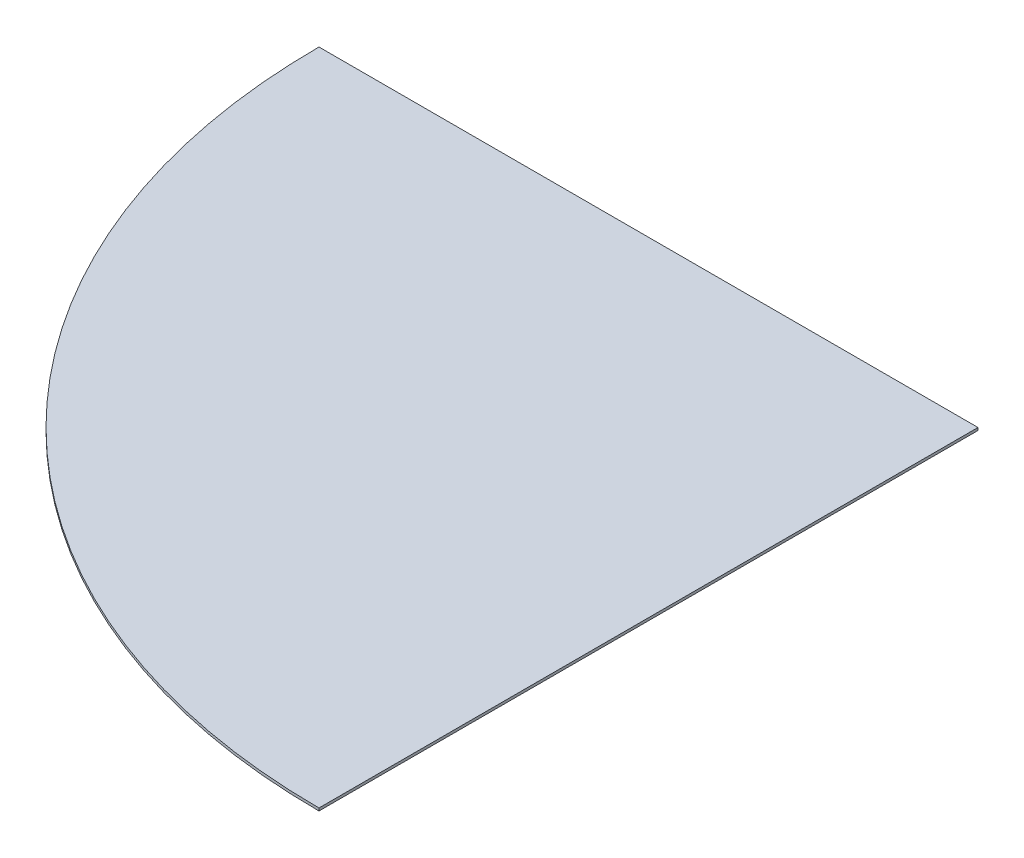
ISO-10303-21;
HEADER;
FILE_DESCRIPTION(('STEP AP214'),'2;1');
FILE_NAME('part.step','',(''),(''),'','','');
FILE_SCHEMA(('AUTOMOTIVE_DESIGN { 1 0 10303 214 1 1 1 1 }'));
ENDSEC;
DATA;
#1=APPLICATION_CONTEXT('core data for automotive mechanical design processes');
#2=APPLICATION_PROTOCOL_DEFINITION('international standard','automotive_design',2000,#1);
#3=PRODUCT_CONTEXT('',#1,'mechanical');
#4=PRODUCT('Part','Part','',(#3));
#5=PRODUCT_RELATED_PRODUCT_CATEGORY('part','',(#4));
#6=PRODUCT_DEFINITION_FORMATION('','',#4);
#7=PRODUCT_DEFINITION_CONTEXT('part definition',#1,'design');
#8=PRODUCT_DEFINITION('design','',#6,#7);
#9=PRODUCT_DEFINITION_SHAPE('','',#8);
#10=(LENGTH_UNIT() NAMED_UNIT(*) SI_UNIT(.MILLI.,.METRE.));
#11=(NAMED_UNIT(*) PLANE_ANGLE_UNIT() SI_UNIT($,.RADIAN.));
#12=(NAMED_UNIT(*) SI_UNIT($,.STERADIAN.) SOLID_ANGLE_UNIT());
#13=UNCERTAINTY_MEASURE_WITH_UNIT(LENGTH_MEASURE(1.E-05),#10,'distance_accuracy_value','');
#14=(GEOMETRIC_REPRESENTATION_CONTEXT(3) GLOBAL_UNCERTAINTY_ASSIGNED_CONTEXT((#13)) GLOBAL_UNIT_ASSIGNED_CONTEXT((#10,
#11,#12)) REPRESENTATION_CONTEXT('',''));
#15=CARTESIAN_POINT('',(0.,0.,0.));
#16=DIRECTION('',(0.,0.,1.));
#17=DIRECTION('',(1.,0.,0.));
#18=AXIS2_PLACEMENT_3D('',#15,#16,#17);
#19=CARTESIAN_POINT('',(-92.5,2.,92.5));
#20=DIRECTION('',(-1.,0.,0.));
#21=DIRECTION('',(0.,0.,1.));
#22=AXIS2_PLACEMENT_3D('',#19,#20,#21);
#23=PLANE('',#22);
#24=DIRECTION('',(0.,0.,-1.));
#25=VECTOR('',#24,1.);
#26=CARTESIAN_POINT('',(-92.5,0.,92.5));
#27=LINE('',#26,#25);
#28=CARTESIAN_POINT('',(-92.5,0.,592.5));
#29=VERTEX_POINT('',#28);
#30=CARTESIAN_POINT('',(-92.5,0.,92.5));
#31=VERTEX_POINT('',#30);
#32=EDGE_CURVE('E83',#29,#31,#27,.T.);
#33=ORIENTED_EDGE('',*,*,#32,.T.);
#34=DIRECTION('',(0.,-1.,0.));
#35=VECTOR('',#34,1.);
#36=CARTESIAN_POINT('',(-92.5,2.,92.5));
#37=LINE('',#36,#35);
#38=CARTESIAN_POINT('',(-92.5,2.,92.5));
#39=VERTEX_POINT('',#38);
#40=EDGE_CURVE('E11',#39,#31,#37,.T.);
#41=ORIENTED_EDGE('',*,*,#40,.F.);
#42=DIRECTION('',(0.,0.,-1.));
#43=VECTOR('',#42,1.);
#44=CARTESIAN_POINT('',(-92.5,2.,92.5));
#45=LINE('',#44,#43);
#46=CARTESIAN_POINT('',(-92.5,2.,592.5));
#47=VERTEX_POINT('',#46);
#48=EDGE_CURVE('E76',#47,#39,#45,.T.);
#49=ORIENTED_EDGE('',*,*,#48,.F.);
#50=DIRECTION('',(0.,-1.,0.));
#51=VECTOR('',#50,1.);
#52=CARTESIAN_POINT('',(-92.5,2.,592.5));
#53=LINE('',#52,#51);
#54=EDGE_CURVE('E84',#47,#29,#53,.T.);
#55=ORIENTED_EDGE('',*,*,#54,.T.);
#56=EDGE_LOOP('',(#33,#41,#49,#55));
#57=FACE_BOUND('',#56,.T.);
#58=ADVANCED_FACE('F36',(#57),#23,.F.);
#59=CARTESIAN_POINT('',(-592.5,2.,92.5000000000001));
#60=DIRECTION('',(0.,0.,1.));
#61=DIRECTION('',(1.,0.,0.));
#62=AXIS2_PLACEMENT_3D('',#59,#60,#61);
#63=PLANE('',#62);
#64=DIRECTION('',(-1.,0.,0.));
#65=VECTOR('',#64,1.);
#66=CARTESIAN_POINT('',(-592.5,0.,92.5000000000001));
#67=LINE('',#66,#65);
#68=CARTESIAN_POINT('',(-592.5,0.,92.5000000000001));
#69=VERTEX_POINT('',#68);
#70=EDGE_CURVE('E64',#31,#69,#67,.T.);
#71=ORIENTED_EDGE('',*,*,#70,.T.);
#72=DIRECTION('',(0.,-1.,0.));
#73=VECTOR('',#72,1.);
#74=CARTESIAN_POINT('',(-592.5,2.,92.5000000000001));
#75=LINE('',#74,#73);
#76=CARTESIAN_POINT('',(-592.5,2.,92.5000000000001));
#77=VERTEX_POINT('',#76);
#78=EDGE_CURVE('E44',#77,#69,#75,.T.);
#79=ORIENTED_EDGE('',*,*,#78,.F.);
#80=DIRECTION('',(-1.,0.,0.));
#81=VECTOR('',#80,1.);
#82=CARTESIAN_POINT('',(-592.5,2.,92.5000000000001));
#83=LINE('',#82,#81);
#84=EDGE_CURVE('E72',#39,#77,#83,.T.);
#85=ORIENTED_EDGE('',*,*,#84,.F.);
#86=ORIENTED_EDGE('',*,*,#40,.T.);
#87=EDGE_LOOP('',(#71,#79,#85,#86));
#88=FACE_BOUND('',#87,.T.);
#89=ADVANCED_FACE('F73',(#88),#63,.F.);
#90=CARTESIAN_POINT('',(-92.5,2.,92.5));
#91=DIRECTION('',(0.,-1.,0.));
#92=DIRECTION('',(0.,0.,-1.));
#93=AXIS2_PLACEMENT_3D('',#90,#91,#92);
#94=CYLINDRICAL_SURFACE('',#93,500.);
#95=CARTESIAN_POINT('',(-92.5,0.,92.5));
#96=DIRECTION('',(0.,1.,0.));
#97=DIRECTION('',(0.,0.,1.));
#98=AXIS2_PLACEMENT_3D('',#95,#96,#97);
#99=CIRCLE('',#98,500.);
#100=EDGE_CURVE('E69',#69,#29,#99,.T.);
#101=ORIENTED_EDGE('',*,*,#100,.T.);
#102=ORIENTED_EDGE('',*,*,#54,.F.);
#103=CARTESIAN_POINT('',(-92.5,2.,92.5));
#104=DIRECTION('',(0.,1.,0.));
#105=DIRECTION('',(0.,0.,1.));
#106=AXIS2_PLACEMENT_3D('',#103,#104,#105);
#107=CIRCLE('',#106,500.);
#108=EDGE_CURVE('E52',#77,#47,#107,.T.);
#109=ORIENTED_EDGE('',*,*,#108,.F.);
#110=ORIENTED_EDGE('',*,*,#78,.T.);
#111=EDGE_LOOP('',(#101,#102,#109,#110));
#112=FACE_BOUND('',#111,.T.);
#113=ADVANCED_FACE('F91',(#112),#94,.T.);
#114=CARTESIAN_POINT('',(-92.5,2.,92.5));
#115=DIRECTION('',(0.,1.,0.));
#116=DIRECTION('',(0.,0.,1.));
#117=AXIS2_PLACEMENT_3D('',#114,#115,#116);
#118=PLANE('',#117);
#119=ORIENTED_EDGE('',*,*,#48,.T.);
#120=ORIENTED_EDGE('',*,*,#84,.T.);
#121=ORIENTED_EDGE('',*,*,#108,.T.);
#122=EDGE_LOOP('',(#119,#120,#121));
#123=FACE_BOUND('',#122,.T.);
#124=ADVANCED_FACE('F79',(#123),#118,.T.);
#125=CARTESIAN_POINT('',(-92.5,0.,92.5));
#126=DIRECTION('',(0.,1.,0.));
#127=DIRECTION('',(0.,0.,1.));
#128=AXIS2_PLACEMENT_3D('',#125,#126,#127);
#129=PLANE('',#128);
#130=ORIENTED_EDGE('',*,*,#32,.F.);
#131=ORIENTED_EDGE('',*,*,#100,.F.);
#132=ORIENTED_EDGE('',*,*,#70,.F.);
#133=EDGE_LOOP('',(#130,#131,#132));
#134=FACE_BOUND('',#133,.T.);
#135=ADVANCED_FACE('F92',(#134),#129,.F.);
#136=CLOSED_SHELL('',(#58,#89,#113,#124,#135));
#137=MANIFOLD_SOLID_BREP('B2',#136);
#138=ADVANCED_BREP_SHAPE_REPRESENTATION('',(#18,#137),#14);
#139=SHAPE_DEFINITION_REPRESENTATION(#9,#138);
ENDSEC;
END-ISO-10303-21;
